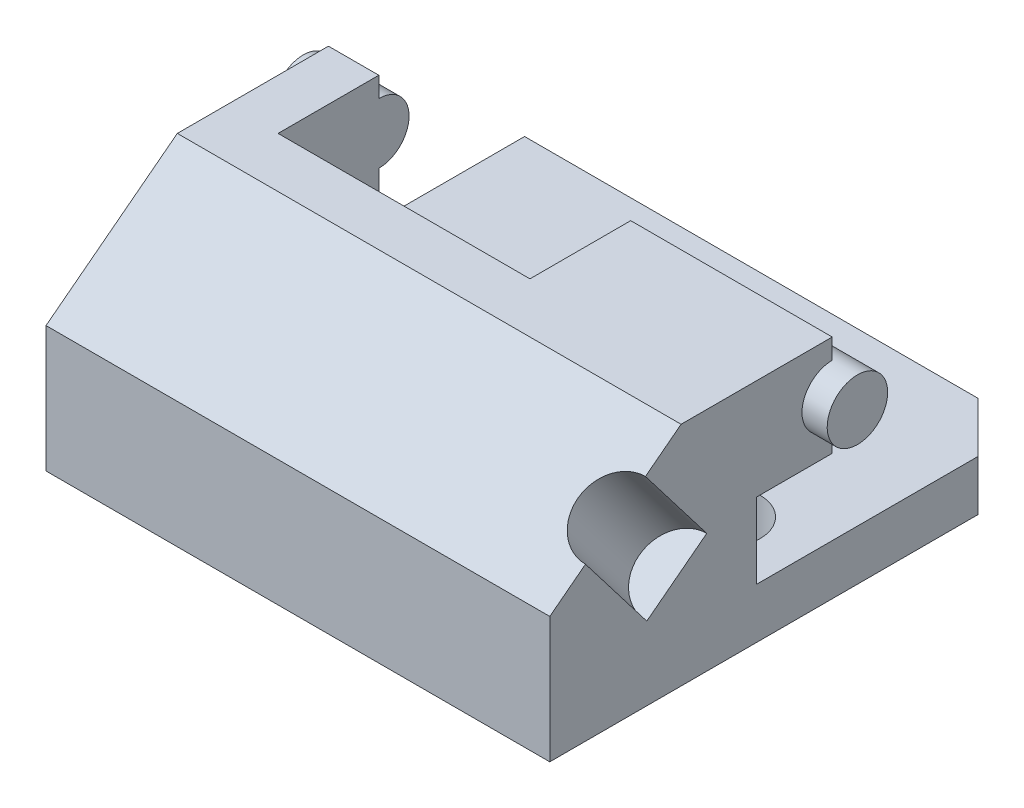
ISO-10303-21;
HEADER;
FILE_DESCRIPTION(('STEP AP214'),'2;1');
FILE_NAME('part.step','',(''),(''),'','','');
FILE_SCHEMA(('AUTOMOTIVE_DESIGN { 1 0 10303 214 1 1 1 1 }'));
ENDSEC;
DATA;
#1=APPLICATION_CONTEXT('core data for automotive mechanical design processes');
#2=APPLICATION_PROTOCOL_DEFINITION('international standard','automotive_design',2000,#1);
#3=PRODUCT_CONTEXT('',#1,'mechanical');
#4=PRODUCT('Part','Part','',(#3));
#5=PRODUCT_RELATED_PRODUCT_CATEGORY('part','',(#4));
#6=PRODUCT_DEFINITION_FORMATION('','',#4);
#7=PRODUCT_DEFINITION_CONTEXT('part definition',#1,'design');
#8=PRODUCT_DEFINITION('design','',#6,#7);
#9=PRODUCT_DEFINITION_SHAPE('','',#8);
#10=(LENGTH_UNIT() NAMED_UNIT(*) SI_UNIT(.MILLI.,.METRE.));
#11=(NAMED_UNIT(*) PLANE_ANGLE_UNIT() SI_UNIT($,.RADIAN.));
#12=(NAMED_UNIT(*) SI_UNIT($,.STERADIAN.) SOLID_ANGLE_UNIT());
#13=UNCERTAINTY_MEASURE_WITH_UNIT(LENGTH_MEASURE(1.E-05),#10,'distance_accuracy_value','');
#14=(GEOMETRIC_REPRESENTATION_CONTEXT(3) GLOBAL_UNCERTAINTY_ASSIGNED_CONTEXT((#13)) GLOBAL_UNIT_ASSIGNED_CONTEXT((#10,
#11,#12)) REPRESENTATION_CONTEXT('',''));
#15=CARTESIAN_POINT('',(0.,0.,0.));
#16=DIRECTION('',(0.,0.,1.));
#17=DIRECTION('',(1.,0.,0.));
#18=AXIS2_PLACEMENT_3D('',#15,#16,#17);
#19=CARTESIAN_POINT('',(100.,25.,-15.));
#20=DIRECTION('',(-1.,0.,0.));
#21=DIRECTION('',(0.,0.,1.));
#22=AXIS2_PLACEMENT_3D('',#19,#20,#21);
#23=CYLINDRICAL_SURFACE('',#22,6.);
#24=CARTESIAN_POINT('',(105.,25.,-15.));
#25=DIRECTION('',(1.,0.,0.));
#26=DIRECTION('',(0.,0.,-1.));
#27=AXIS2_PLACEMENT_3D('',#24,#25,#26);
#28=CIRCLE('',#27,6.00000000000001);
#29=CARTESIAN_POINT('',(105.,25.,-21.));
#30=VERTEX_POINT('',#29);
#31=EDGE_CURVE('E275',#30,#30,#28,.T.);
#32=ORIENTED_EDGE('',*,*,#31,.F.);
#33=EDGE_LOOP('',(#32));
#34=FACE_BOUND('',#33,.T.);
#35=CARTESIAN_POINT('',(60.,25.,-15.));
#36=DIRECTION('',(-1.,0.,0.));
#37=DIRECTION('',(0.,0.,1.));
#38=AXIS2_PLACEMENT_3D('',#35,#36,#37);
#39=CIRCLE('',#38,6.);
#40=CARTESIAN_POINT('',(60.,31.,-15.));
#41=VERTEX_POINT('',#40);
#42=CARTESIAN_POINT('',(60.,19.,-15.));
#43=VERTEX_POINT('',#42);
#44=EDGE_CURVE('E484',#41,#43,#39,.T.);
#45=ORIENTED_EDGE('',*,*,#44,.F.);
#46=DIRECTION('',(-1.,0.,0.));
#47=VECTOR('',#46,1.);
#48=CARTESIAN_POINT('',(100.,31.,-15.));
#49=LINE('',#48,#47);
#50=CARTESIAN_POINT('',(100.,31.,-15.));
#51=VERTEX_POINT('',#50);
#52=EDGE_CURVE('E254',#51,#41,#49,.T.);
#53=ORIENTED_EDGE('',*,*,#52,.F.);
#54=CARTESIAN_POINT('',(100.,25.,-15.));
#55=DIRECTION('',(1.,0.,0.));
#56=DIRECTION('',(0.,0.,-1.));
#57=AXIS2_PLACEMENT_3D('',#54,#55,#56);
#58=CIRCLE('',#57,6.00000000000001);
#59=CARTESIAN_POINT('',(100.,19.,-15.));
#60=VERTEX_POINT('',#59);
#61=EDGE_CURVE('E279',#51,#60,#58,.T.);
#62=ORIENTED_EDGE('',*,*,#61,.T.);
#63=DIRECTION('',(-1.,0.,0.));
#64=VECTOR('',#63,1.);
#65=CARTESIAN_POINT('',(100.,19.,-15.));
#66=LINE('',#65,#64);
#67=EDGE_CURVE('E258',#60,#43,#66,.T.);
#68=ORIENTED_EDGE('',*,*,#67,.T.);
#69=EDGE_LOOP('',(#45,#53,#62,#68));
#70=FACE_BOUND('',#69,.T.);
#71=ADVANCED_FACE('F39',(#34,#70),#23,.T.);
#72=CARTESIAN_POINT('',(-5.,25.,-15.));
#73=DIRECTION('',(-1.,0.,0.));
#74=DIRECTION('',(0.,0.,1.));
#75=AXIS2_PLACEMENT_3D('',#72,#73,#74);
#76=CIRCLE('',#75,6.00000000000001);
#77=CARTESIAN_POINT('',(-5.,25.,-8.99999999999999));
#78=VERTEX_POINT('',#77);
#79=EDGE_CURVE('E273',#78,#78,#76,.T.);
#80=ORIENTED_EDGE('',*,*,#79,.F.);
#81=EDGE_LOOP('',(#80));
#82=FACE_BOUND('',#81,.T.);
#83=CARTESIAN_POINT('',(9.99999999999999,25.,-15.));
#84=DIRECTION('',(1.,0.,0.));
#85=DIRECTION('',(0.,0.,-1.));
#86=AXIS2_PLACEMENT_3D('',#83,#84,#85);
#87=CIRCLE('',#86,6.);
#88=CARTESIAN_POINT('',(10.,19.,-15.));
#89=VERTEX_POINT('',#88);
#90=CARTESIAN_POINT('',(10.,31.,-15.));
#91=VERTEX_POINT('',#90);
#92=EDGE_CURVE('E482',#89,#91,#87,.T.);
#93=ORIENTED_EDGE('',*,*,#92,.F.);
#94=CARTESIAN_POINT('',(0.,19.,-15.));
#95=VERTEX_POINT('',#94);
#96=EDGE_CURVE('E257',#89,#95,#66,.T.);
#97=ORIENTED_EDGE('',*,*,#96,.T.);
#98=CARTESIAN_POINT('',(0.,25.,-15.));
#99=DIRECTION('',(-1.,0.,0.));
#100=DIRECTION('',(0.,0.,1.));
#101=AXIS2_PLACEMENT_3D('',#98,#99,#100);
#102=CIRCLE('',#101,6.00000000000001);
#103=CARTESIAN_POINT('',(0.,31.,-15.));
#104=VERTEX_POINT('',#103);
#105=EDGE_CURVE('E260',#95,#104,#102,.T.);
#106=ORIENTED_EDGE('',*,*,#105,.T.);
#107=EDGE_CURVE('E253',#91,#104,#49,.T.);
#108=ORIENTED_EDGE('',*,*,#107,.F.);
#109=EDGE_LOOP('',(#93,#97,#106,#108));
#110=FACE_BOUND('',#109,.T.);
#111=ADVANCED_FACE('F433',(#82,#110),#23,.T.);
#112=CARTESIAN_POINT('',(100.,0.,-15.));
#113=DIRECTION('',(0.,0.,1.));
#114=DIRECTION('',(0.,-1.,0.));
#115=AXIS2_PLACEMENT_3D('',#112,#113,#114);
#116=PLANE('',#115);
#117=ORIENTED_EDGE('',*,*,#96,.F.);
#118=DIRECTION('',(0.,1.,0.));
#119=VECTOR('',#118,1.);
#120=CARTESIAN_POINT('',(10.,-53.851648071345,-15.));
#121=LINE('',#120,#119);
#122=CARTESIAN_POINT('',(10.,15.,-15.));
#123=VERTEX_POINT('',#122);
#124=EDGE_CURVE('E354',#123,#89,#121,.T.);
#125=ORIENTED_EDGE('',*,*,#124,.F.);
#126=DIRECTION('',(-1.,0.,0.));
#127=VECTOR('',#126,1.);
#128=CARTESIAN_POINT('',(100.,15.,-15.));
#129=LINE('',#128,#127);
#130=CARTESIAN_POINT('',(0.,15.,-15.));
#131=VERTEX_POINT('',#130);
#132=EDGE_CURVE('E304',#123,#131,#129,.T.);
#133=ORIENTED_EDGE('',*,*,#132,.T.);
#134=DIRECTION('',(0.,1.,0.));
#135=VECTOR('',#134,1.);
#136=CARTESIAN_POINT('',(0.,0.,-15.));
#137=LINE('',#136,#135);
#138=EDGE_CURVE('E278',#131,#95,#137,.T.);
#139=ORIENTED_EDGE('',*,*,#138,.T.);
#140=EDGE_LOOP('',(#117,#125,#133,#139));
#141=FACE_BOUND('',#140,.T.);
#142=ADVANCED_FACE('F351',(#141),#116,.F.);
#143=CARTESIAN_POINT('',(100.,0.,-15.));
#144=DIRECTION('',(0.,0.,1.));
#145=DIRECTION('',(0.,-1.,0.));
#146=AXIS2_PLACEMENT_3D('',#143,#144,#145);
#147=PLANE('',#146);
#148=DIRECTION('',(-1.,0.,0.));
#149=VECTOR('',#148,1.);
#150=CARTESIAN_POINT('',(100.,35.,-15.));
#151=LINE('',#150,#149);
#152=CARTESIAN_POINT('',(10.,35.,-15.));
#153=VERTEX_POINT('',#152);
#154=CARTESIAN_POINT('',(0.,35.,-15.));
#155=VERTEX_POINT('',#154);
#156=EDGE_CURVE('E249',#153,#155,#151,.T.);
#157=ORIENTED_EDGE('',*,*,#156,.F.);
#158=EDGE_CURVE('E357',#91,#153,#121,.T.);
#159=ORIENTED_EDGE('',*,*,#158,.F.);
#160=ORIENTED_EDGE('',*,*,#107,.T.);
#161=DIRECTION('',(0.,1.,0.));
#162=VECTOR('',#161,1.);
#163=CARTESIAN_POINT('',(0.,0.,-15.));
#164=LINE('',#163,#162);
#165=EDGE_CURVE('E307',#104,#155,#164,.T.);
#166=ORIENTED_EDGE('',*,*,#165,.T.);
#167=EDGE_LOOP('',(#157,#159,#160,#166));
#168=FACE_BOUND('',#167,.T.);
#169=ADVANCED_FACE('F446',(#168),#147,.F.);
#170=CARTESIAN_POINT('',(100.,0.,0.));
#171=DIRECTION('',(0.,0.,1.));
#172=DIRECTION('',(1.,0.,0.));
#173=AXIS2_PLACEMENT_3D('',#170,#171,#172);
#174=PLANE('',#173);
#175=DIRECTION('',(-1.,0.,0.));
#176=VECTOR('',#175,1.);
#177=CARTESIAN_POINT('',(100.,15.,0.));
#178=LINE('',#177,#176);
#179=CARTESIAN_POINT('',(10.,15.,0.));
#180=VERTEX_POINT('',#179);
#181=CARTESIAN_POINT('',(0.,15.,0.));
#182=VERTEX_POINT('',#181);
#183=EDGE_CURVE('E331',#180,#182,#178,.T.);
#184=ORIENTED_EDGE('',*,*,#183,.F.);
#185=DIRECTION('',(0.,-1.,0.));
#186=VECTOR('',#185,1.);
#187=CARTESIAN_POINT('',(10.,0.,0.));
#188=LINE('',#187,#186);
#189=CARTESIAN_POINT('',(10.,0.,0.));
#190=VERTEX_POINT('',#189);
#191=EDGE_CURVE('E377',#180,#190,#188,.T.);
#192=ORIENTED_EDGE('',*,*,#191,.T.);
#193=DIRECTION('',(-1.,0.,0.));
#194=VECTOR('',#193,1.);
#195=CARTESIAN_POINT('',(100.,0.,0.));
#196=LINE('',#195,#194);
#197=CARTESIAN_POINT('',(0.,0.,0.));
#198=VERTEX_POINT('',#197);
#199=EDGE_CURVE('E240',#190,#198,#196,.T.);
#200=ORIENTED_EDGE('',*,*,#199,.T.);
#201=DIRECTION('',(0.,1.,0.));
#202=VECTOR('',#201,1.);
#203=CARTESIAN_POINT('',(0.,0.,0.));
#204=LINE('',#203,#202);
#205=EDGE_CURVE('E325',#198,#182,#204,.T.);
#206=ORIENTED_EDGE('',*,*,#205,.T.);
#207=EDGE_LOOP('',(#184,#192,#200,#206));
#208=FACE_BOUND('',#207,.T.);
#209=ADVANCED_FACE('F344',(#208),#174,.F.);
#210=CARTESIAN_POINT('',(100.,15.,0.));
#211=DIRECTION('',(0.,1.,0.));
#212=DIRECTION('',(0.,0.,1.));
#213=AXIS2_PLACEMENT_3D('',#210,#211,#212);
#214=PLANE('',#213);
#215=ORIENTED_EDGE('',*,*,#132,.F.);
#216=DIRECTION('',(0.,0.,1.));
#217=VECTOR('',#216,1.);
#218=CARTESIAN_POINT('',(10.,15.,0.));
#219=LINE('',#218,#217);
#220=EDGE_CURVE('E11',#123,#180,#219,.T.);
#221=ORIENTED_EDGE('',*,*,#220,.T.);
#222=ORIENTED_EDGE('',*,*,#183,.T.);
#223=DIRECTION('',(0.,0.,-1.));
#224=VECTOR('',#223,1.);
#225=CARTESIAN_POINT('',(0.,15.,0.));
#226=LINE('',#225,#224);
#227=EDGE_CURVE('E285',#182,#131,#226,.T.);
#228=ORIENTED_EDGE('',*,*,#227,.T.);
#229=EDGE_LOOP('',(#215,#221,#222,#228));
#230=FACE_BOUND('',#229,.T.);
#231=ADVANCED_FACE('F338',(#230),#214,.F.);
#232=CARTESIAN_POINT('',(100.,15.,-15.));
#233=VERTEX_POINT('',#232);
#234=CARTESIAN_POINT('',(60.,15.,-15.));
#235=VERTEX_POINT('',#234);
#236=EDGE_CURVE('E330',#233,#235,#129,.T.);
#237=ORIENTED_EDGE('',*,*,#236,.T.);
#238=DIRECTION('',(0.,1.,0.));
#239=VECTOR('',#238,1.);
#240=CARTESIAN_POINT('',(60.,-53.851648071345,-15.));
#241=LINE('',#240,#239);
#242=EDGE_CURVE('E361',#235,#43,#241,.T.);
#243=ORIENTED_EDGE('',*,*,#242,.T.);
#244=ORIENTED_EDGE('',*,*,#67,.F.);
#245=DIRECTION('',(0.,1.,0.));
#246=VECTOR('',#245,1.);
#247=CARTESIAN_POINT('',(100.,0.,-15.));
#248=LINE('',#247,#246);
#249=EDGE_CURVE('E282',#233,#60,#248,.T.);
#250=ORIENTED_EDGE('',*,*,#249,.F.);
#251=EDGE_LOOP('',(#237,#243,#244,#250));
#252=FACE_BOUND('',#251,.T.);
#253=ADVANCED_FACE('F41',(#252),#116,.F.);
#254=ORIENTED_EDGE('',*,*,#52,.T.);
#255=CARTESIAN_POINT('',(60.,35.,-15.));
#256=VERTEX_POINT('',#255);
#257=EDGE_CURVE('E364',#41,#256,#241,.T.);
#258=ORIENTED_EDGE('',*,*,#257,.T.);
#259=CARTESIAN_POINT('',(100.,35.,-15.));
#260=VERTEX_POINT('',#259);
#261=EDGE_CURVE('E250',#260,#256,#151,.T.);
#262=ORIENTED_EDGE('',*,*,#261,.F.);
#263=DIRECTION('',(0.,1.,0.));
#264=VECTOR('',#263,1.);
#265=CARTESIAN_POINT('',(100.,0.,-15.));
#266=LINE('',#265,#264);
#267=EDGE_CURVE('E284',#51,#260,#266,.T.);
#268=ORIENTED_EDGE('',*,*,#267,.F.);
#269=EDGE_LOOP('',(#254,#258,#262,#268));
#270=FACE_BOUND('',#269,.T.);
#271=ADVANCED_FACE('F442',(#270),#147,.F.);
#272=CARTESIAN_POINT('',(100.,35.,0.));
#273=DIRECTION('',(0.,1.,0.));
#274=DIRECTION('',(0.,0.,1.));
#275=AXIS2_PLACEMENT_3D('',#272,#273,#274);
#276=PLANE('',#275);
#277=DIRECTION('',(0.,0.,1.));
#278=VECTOR('',#277,1.);
#279=CARTESIAN_POINT('',(10.,35.,0.));
#280=LINE('',#279,#278);
#281=CARTESIAN_POINT('',(10.,35.,5.00000000000001));
#282=VERTEX_POINT('',#281);
#283=EDGE_CURVE('E370',#153,#282,#280,.T.);
#284=ORIENTED_EDGE('',*,*,#283,.F.);
#285=ORIENTED_EDGE('',*,*,#156,.T.);
#286=DIRECTION('',(0.,0.,-1.));
#287=VECTOR('',#286,1.);
#288=CARTESIAN_POINT('',(0.,35.,0.));
#289=LINE('',#288,#287);
#290=CARTESIAN_POINT('',(0.,35.,15.));
#291=VERTEX_POINT('',#290);
#292=EDGE_CURVE('E310',#291,#155,#289,.T.);
#293=ORIENTED_EDGE('',*,*,#292,.F.);
#294=DIRECTION('',(-1.,0.,0.));
#295=VECTOR('',#294,1.);
#296=CARTESIAN_POINT('',(100.,35.,15.));
#297=LINE('',#296,#295);
#298=CARTESIAN_POINT('',(100.,35.,15.));
#299=VERTEX_POINT('',#298);
#300=EDGE_CURVE('E247',#299,#291,#297,.T.);
#301=ORIENTED_EDGE('',*,*,#300,.F.);
#302=DIRECTION('',(0.,0.,-1.));
#303=VECTOR('',#302,1.);
#304=CARTESIAN_POINT('',(100.,35.,0.));
#305=LINE('',#304,#303);
#306=EDGE_CURVE('E287',#299,#260,#305,.T.);
#307=ORIENTED_EDGE('',*,*,#306,.T.);
#308=ORIENTED_EDGE('',*,*,#261,.T.);
#309=DIRECTION('',(0.,0.,-1.));
#310=VECTOR('',#309,1.);
#311=CARTESIAN_POINT('',(60.,35.,0.));
#312=LINE('',#311,#310);
#313=CARTESIAN_POINT('',(60.,35.,5.00000000000001));
#314=VERTEX_POINT('',#313);
#315=EDGE_CURVE('E498',#314,#256,#312,.T.);
#316=ORIENTED_EDGE('',*,*,#315,.F.);
#317=DIRECTION('',(1.,0.,0.));
#318=VECTOR('',#317,1.);
#319=CARTESIAN_POINT('',(0.,35.,5.00000000000001));
#320=LINE('',#319,#318);
#321=EDGE_CURVE('E487',#282,#314,#320,.T.);
#322=ORIENTED_EDGE('',*,*,#321,.F.);
#323=EDGE_LOOP('',(#284,#285,#293,#301,#307,#308,#316,#322));
#324=FACE_BOUND('',#323,.T.);
#325=ADVANCED_FACE('F407',(#324),#276,.T.);
#326=CARTESIAN_POINT('',(100.,29.2737769864622,22.4625591217898));
#327=DIRECTION('',(0.,0.793353340291236,0.608761429008719));
#328=DIRECTION('',(0.,-0.608761429008719,0.793353340291236));
#329=AXIS2_PLACEMENT_3D('',#326,#327,#328);
#330=PLANE('',#329);
#331=CARTESIAN_POINT('',(100.,25.,28.0322537284122));
#332=DIRECTION('',(0.,0.793353340291236,0.608761429008719));
#333=DIRECTION('',(0.,-0.608761429008719,0.793353340291236));
#334=AXIS2_PLACEMENT_3D('',#331,#332,#333);
#335=CIRCLE('',#334,7.50000000000001);
#336=CARTESIAN_POINT('',(100.,29.5657107175654,22.0821036762279));
#337=VERTEX_POINT('',#336);
#338=CARTESIAN_POINT('',(100.,20.4342892824346,33.9824037805964));
#339=VERTEX_POINT('',#338);
#340=EDGE_CURVE('E379',#337,#339,#335,.T.);
#341=ORIENTED_EDGE('',*,*,#340,.F.);
#342=DIRECTION('',(0.,0.608761429008719,-0.793353340291236));
#343=VECTOR('',#342,1.);
#344=CARTESIAN_POINT('',(100.,29.2737769864622,22.4625591217898));
#345=LINE('',#344,#343);
#346=EDGE_CURVE('E290',#337,#299,#345,.T.);
#347=ORIENTED_EDGE('',*,*,#346,.T.);
#348=ORIENTED_EDGE('',*,*,#300,.T.);
#349=DIRECTION('',(0.,0.608761429008719,-0.793353340291236));
#350=VECTOR('',#349,1.);
#351=CARTESIAN_POINT('',(0.,29.2737769864622,22.4625591217898));
#352=LINE('',#351,#350);
#353=CARTESIAN_POINT('',(0.,15.,41.0645074568242));
#354=VERTEX_POINT('',#353);
#355=EDGE_CURVE('E313',#354,#291,#352,.T.);
#356=ORIENTED_EDGE('',*,*,#355,.F.);
#357=DIRECTION('',(-1.,0.,0.));
#358=VECTOR('',#357,1.);
#359=CARTESIAN_POINT('',(100.,15.,41.0645074568242));
#360=LINE('',#359,#358);
#361=CARTESIAN_POINT('',(100.,15.,41.0645074568242));
#362=VERTEX_POINT('',#361);
#363=EDGE_CURVE('E245',#362,#354,#360,.T.);
#364=ORIENTED_EDGE('',*,*,#363,.F.);
#365=EDGE_CURVE('E291',#362,#339,#345,.T.);
#366=ORIENTED_EDGE('',*,*,#365,.T.);
#367=EDGE_LOOP('',(#341,#347,#348,#356,#364,#366));
#368=FACE_BOUND('',#367,.T.);
#369=ADVANCED_FACE('F398',(#368),#330,.T.);
#370=CARTESIAN_POINT('',(100.,0.,41.0645074568242));
#371=DIRECTION('',(0.,0.,1.));
#372=DIRECTION('',(1.,0.,0.));
#373=AXIS2_PLACEMENT_3D('',#370,#371,#372);
#374=PLANE('',#373);
#375=DIRECTION('',(0.,1.,0.));
#376=VECTOR('',#375,1.);
#377=CARTESIAN_POINT('',(0.,0.,41.0645074568242));
#378=LINE('',#377,#376);
#379=CARTESIAN_POINT('',(0.,-10.,41.0645074568242));
#380=VERTEX_POINT('',#379);
#381=EDGE_CURVE('E316',#380,#354,#378,.T.);
#382=ORIENTED_EDGE('',*,*,#381,.F.);
#383=DIRECTION('',(-1.,0.,0.));
#384=VECTOR('',#383,1.);
#385=CARTESIAN_POINT('',(100.,-10.,41.0645074568242));
#386=LINE('',#385,#384);
#387=CARTESIAN_POINT('',(100.,-10.,41.0645074568242));
#388=VERTEX_POINT('',#387);
#389=EDGE_CURVE('E237',#388,#380,#386,.T.);
#390=ORIENTED_EDGE('',*,*,#389,.F.);
#391=DIRECTION('',(0.,1.,0.));
#392=VECTOR('',#391,1.);
#393=CARTESIAN_POINT('',(100.,0.,41.0645074568242));
#394=LINE('',#393,#392);
#395=EDGE_CURVE('E294',#388,#362,#394,.T.);
#396=ORIENTED_EDGE('',*,*,#395,.T.);
#397=ORIENTED_EDGE('',*,*,#363,.T.);
#398=EDGE_LOOP('',(#382,#390,#396,#397));
#399=FACE_BOUND('',#398,.T.);
#400=ADVANCED_FACE('F415',(#399),#374,.T.);
#401=CARTESIAN_POINT('',(100.,-10.,0.));
#402=DIRECTION('',(0.,-1.,0.));
#403=DIRECTION('',(0.,0.,-1.));
#404=AXIS2_PLACEMENT_3D('',#401,#402,#403);
#405=PLANE('',#404);
#406=DIRECTION('',(-0.707106781186544,0.,-0.707106781186551));
#407=VECTOR('',#406,1.);
#408=CARTESIAN_POINT('',(100.,-10.,-43.9354925431758));
#409=LINE('',#408,#407);
#410=CARTESIAN_POINT('',(100.,-10.,-43.9354925431758));
#411=VERTEX_POINT('',#410);
#412=CARTESIAN_POINT('',(90.0000000000001,-10.,-53.9354925431758));
#413=VERTEX_POINT('',#412);
#414=EDGE_CURVE('E213',#411,#413,#409,.T.);
#415=ORIENTED_EDGE('',*,*,#414,.F.);
#416=DIRECTION('',(0.,0.,1.));
#417=VECTOR('',#416,1.);
#418=CARTESIAN_POINT('',(100.,-10.,0.));
#419=LINE('',#418,#417);
#420=EDGE_CURVE('E297',#411,#388,#419,.T.);
#421=ORIENTED_EDGE('',*,*,#420,.T.);
#422=ORIENTED_EDGE('',*,*,#389,.T.);
#423=DIRECTION('',(0.,0.,1.));
#424=VECTOR('',#423,1.);
#425=CARTESIAN_POINT('',(0.,-10.,0.));
#426=LINE('',#425,#424);
#427=CARTESIAN_POINT('',(0.,-10.,-53.9354925431758));
#428=VERTEX_POINT('',#427);
#429=EDGE_CURVE('E319',#428,#380,#426,.T.);
#430=ORIENTED_EDGE('',*,*,#429,.F.);
#431=DIRECTION('',(-1.,0.,0.));
#432=VECTOR('',#431,1.);
#433=CARTESIAN_POINT('',(100.,-10.,-53.9354925431758));
#434=LINE('',#433,#432);
#435=EDGE_CURVE('E234',#413,#428,#434,.T.);
#436=ORIENTED_EDGE('',*,*,#435,.F.);
#437=EDGE_LOOP('',(#415,#421,#422,#430,#436));
#438=FACE_BOUND('',#437,.T.);
#439=CARTESIAN_POINT('',(15.,-10.,-8.14899713183087));
#440=DIRECTION('',(0.,-1.,0.));
#441=DIRECTION('',(0.,0.,-1.));
#442=AXIS2_PLACEMENT_3D('',#439,#440,#441);
#443=CIRCLE('',#442,7.5);
#444=CARTESIAN_POINT('',(15.,-10.,-15.6489971318309));
#445=VERTEX_POINT('',#444);
#446=EDGE_CURVE('E490',#445,#445,#443,.T.);
#447=ORIENTED_EDGE('',*,*,#446,.F.);
#448=EDGE_LOOP('',(#447));
#449=FACE_BOUND('',#448,.T.);
#450=CARTESIAN_POINT('',(35.,-10.,-8.14899713183087));
#451=DIRECTION('',(0.,-1.,0.));
#452=DIRECTION('',(0.,0.,-1.));
#453=AXIS2_PLACEMENT_3D('',#450,#451,#452);
#454=CIRCLE('',#453,7.5);
#455=CARTESIAN_POINT('',(35.,-10.,-0.648997131830871));
#456=VERTEX_POINT('',#455);
#457=CARTESIAN_POINT('',(35.,-10.,-15.6489971318309));
#458=VERTEX_POINT('',#457);
#459=EDGE_CURVE('E62',#456,#458,#454,.T.);
#460=ORIENTED_EDGE('',*,*,#459,.F.);
#461=DIRECTION('',(1.,0.,0.));
#462=VECTOR('',#461,1.);
#463=CARTESIAN_POINT('',(0.,-10.,-0.648997131830871));
#464=LINE('',#463,#462);
#465=CARTESIAN_POINT('',(65.,-10.,-0.648997131830871));
#466=VERTEX_POINT('',#465);
#467=EDGE_CURVE('E522',#456,#466,#464,.T.);
#468=ORIENTED_EDGE('',*,*,#467,.T.);
#469=CARTESIAN_POINT('',(65.,-10.,-8.14899713183087));
#470=DIRECTION('',(0.,-1.,0.));
#471=DIRECTION('',(0.,0.,-1.));
#472=AXIS2_PLACEMENT_3D('',#469,#470,#471);
#473=CIRCLE('',#472,7.5);
#474=CARTESIAN_POINT('',(65.,-10.,-15.6489971318309));
#475=VERTEX_POINT('',#474);
#476=EDGE_CURVE('E536',#475,#466,#473,.T.);
#477=ORIENTED_EDGE('',*,*,#476,.F.);
#478=DIRECTION('',(1.,0.,0.));
#479=VECTOR('',#478,1.);
#480=CARTESIAN_POINT('',(0.,-10.,-15.6489971318309));
#481=LINE('',#480,#479);
#482=EDGE_CURVE('E532',#458,#475,#481,.T.);
#483=ORIENTED_EDGE('',*,*,#482,.F.);
#484=EDGE_LOOP('',(#460,#468,#477,#483));
#485=FACE_BOUND('',#484,.T.);
#486=CARTESIAN_POINT('',(85.,-10.,-8.14899713183087));
#487=DIRECTION('',(0.,-1.,0.));
#488=DIRECTION('',(0.,0.,-1.));
#489=AXIS2_PLACEMENT_3D('',#486,#487,#488);
#490=CIRCLE('',#489,7.5);
#491=CARTESIAN_POINT('',(85.,-10.,-15.6489971318309));
#492=VERTEX_POINT('',#491);
#493=EDGE_CURVE('E217',#492,#492,#490,.T.);
#494=ORIENTED_EDGE('',*,*,#493,.F.);
#495=EDGE_LOOP('',(#494));
#496=FACE_BOUND('',#495,.T.);
#497=ADVANCED_FACE('F453',(#438,#449,#485,#496),#405,.T.);
#498=CARTESIAN_POINT('',(100.,0.,-53.9354925431758));
#499=DIRECTION('',(0.,0.,-1.));
#500=DIRECTION('',(0.,1.,0.));
#501=AXIS2_PLACEMENT_3D('',#498,#499,#500);
#502=PLANE('',#501);
#503=DIRECTION('',(0.,-1.,0.));
#504=VECTOR('',#503,1.);
#505=CARTESIAN_POINT('',(90.0000000000001,0.,-53.9354925431758));
#506=LINE('',#505,#504);
#507=CARTESIAN_POINT('',(90.0000000000001,0.,-53.9354925431758));
#508=VERTEX_POINT('',#507);
#509=EDGE_CURVE('E210',#508,#413,#506,.T.);
#510=ORIENTED_EDGE('',*,*,#509,.T.);
#511=ORIENTED_EDGE('',*,*,#435,.T.);
#512=DIRECTION('',(0.,-1.,0.));
#513=VECTOR('',#512,1.);
#514=CARTESIAN_POINT('',(0.,0.,-53.9354925431758));
#515=LINE('',#514,#513);
#516=CARTESIAN_POINT('',(0.,0.,-53.9354925431758));
#517=VERTEX_POINT('',#516);
#518=EDGE_CURVE('E232',#517,#428,#515,.T.);
#519=ORIENTED_EDGE('',*,*,#518,.F.);
#520=DIRECTION('',(-1.,0.,0.));
#521=VECTOR('',#520,1.);
#522=CARTESIAN_POINT('',(100.,0.,-53.9354925431758));
#523=LINE('',#522,#521);
#524=EDGE_CURVE('E225',#508,#517,#523,.T.);
#525=ORIENTED_EDGE('',*,*,#524,.F.);
#526=EDGE_LOOP('',(#510,#511,#519,#525));
#527=FACE_BOUND('',#526,.T.);
#528=ADVANCED_FACE('F230',(#527),#502,.T.);
#529=CARTESIAN_POINT('',(100.,0.,0.));
#530=DIRECTION('',(0.,1.,0.));
#531=DIRECTION('',(0.,0.,1.));
#532=AXIS2_PLACEMENT_3D('',#529,#530,#531);
#533=PLANE('',#532);
#534=DIRECTION('',(-0.707106781186544,0.,-0.707106781186551));
#535=VECTOR('',#534,1.);
#536=CARTESIAN_POINT('',(100.,0.,-43.9354925431758));
#537=LINE('',#536,#535);
#538=CARTESIAN_POINT('',(100.,0.,-43.9354925431758));
#539=VERTEX_POINT('',#538);
#540=EDGE_CURVE('E54',#539,#508,#537,.T.);
#541=ORIENTED_EDGE('',*,*,#540,.T.);
#542=ORIENTED_EDGE('',*,*,#524,.T.);
#543=DIRECTION('',(0.,0.,-1.));
#544=VECTOR('',#543,1.);
#545=CARTESIAN_POINT('',(0.,0.,0.));
#546=LINE('',#545,#544);
#547=EDGE_CURVE('E323',#198,#517,#546,.T.);
#548=ORIENTED_EDGE('',*,*,#547,.F.);
#549=ORIENTED_EDGE('',*,*,#199,.F.);
#550=DIRECTION('',(0.,0.,-1.));
#551=VECTOR('',#550,1.);
#552=CARTESIAN_POINT('',(10.,0.,0.));
#553=LINE('',#552,#551);
#554=CARTESIAN_POINT('',(10.,0.,5.00000000000001));
#555=VERTEX_POINT('',#554);
#556=EDGE_CURVE('E359',#555,#190,#553,.T.);
#557=ORIENTED_EDGE('',*,*,#556,.F.);
#558=DIRECTION('',(-1.,0.,0.));
#559=VECTOR('',#558,1.);
#560=CARTESIAN_POINT('',(0.,0.,5.00000000000001));
#561=LINE('',#560,#559);
#562=CARTESIAN_POINT('',(60.,0.,5.00000000000001));
#563=VERTEX_POINT('',#562);
#564=EDGE_CURVE('E374',#563,#555,#561,.T.);
#565=ORIENTED_EDGE('',*,*,#564,.F.);
#566=DIRECTION('',(0.,0.,1.));
#567=VECTOR('',#566,1.);
#568=CARTESIAN_POINT('',(60.,0.,0.));
#569=LINE('',#568,#567);
#570=CARTESIAN_POINT('',(60.,0.,0.));
#571=VERTEX_POINT('',#570);
#572=EDGE_CURVE('E371',#571,#563,#569,.T.);
#573=ORIENTED_EDGE('',*,*,#572,.F.);
#574=CARTESIAN_POINT('',(100.,0.,0.));
#575=VERTEX_POINT('',#574);
#576=EDGE_CURVE('E235',#575,#571,#196,.T.);
#577=ORIENTED_EDGE('',*,*,#576,.F.);
#578=DIRECTION('',(0.,0.,-1.));
#579=VECTOR('',#578,1.);
#580=CARTESIAN_POINT('',(100.,0.,0.));
#581=LINE('',#580,#579);
#582=EDGE_CURVE('E228',#575,#539,#581,.T.);
#583=ORIENTED_EDGE('',*,*,#582,.T.);
#584=EDGE_LOOP('',(#541,#542,#548,#549,#557,#565,#573,#577,#583));
#585=FACE_BOUND('',#584,.T.);
#586=CARTESIAN_POINT('',(15.,0.,-8.14899713183087));
#587=DIRECTION('',(0.,-1.,0.));
#588=DIRECTION('',(0.,0.,-1.));
#589=AXIS2_PLACEMENT_3D('',#586,#587,#588);
#590=CIRCLE('',#589,7.5);
#591=CARTESIAN_POINT('',(15.,0.,-15.6489971318309));
#592=VERTEX_POINT('',#591);
#593=EDGE_CURVE('E485',#592,#592,#590,.T.);
#594=ORIENTED_EDGE('',*,*,#593,.T.);
#595=EDGE_LOOP('',(#594));
#596=FACE_BOUND('',#595,.T.);
#597=CARTESIAN_POINT('',(35.,0.,-8.14899713183087));
#598=DIRECTION('',(0.,-1.,0.));
#599=DIRECTION('',(0.,0.,-1.));
#600=AXIS2_PLACEMENT_3D('',#597,#598,#599);
#601=CIRCLE('',#600,7.5);
#602=CARTESIAN_POINT('',(35.,0.,-0.648997131830867));
#603=VERTEX_POINT('',#602);
#604=CARTESIAN_POINT('',(35.,0.,-15.6489971318309));
#605=VERTEX_POINT('',#604);
#606=EDGE_CURVE('E518',#603,#605,#601,.T.);
#607=ORIENTED_EDGE('',*,*,#606,.T.);
#608=DIRECTION('',(1.,0.,0.));
#609=VECTOR('',#608,1.);
#610=CARTESIAN_POINT('',(0.,0.,-15.6489971318309));
#611=LINE('',#610,#609);
#612=CARTESIAN_POINT('',(65.,0.,-15.6489971318309));
#613=VERTEX_POINT('',#612);
#614=EDGE_CURVE('E521',#605,#613,#611,.T.);
#615=ORIENTED_EDGE('',*,*,#614,.T.);
#616=CARTESIAN_POINT('',(65.,0.,-8.14899713183087));
#617=DIRECTION('',(0.,-1.,0.));
#618=DIRECTION('',(0.,0.,-1.));
#619=AXIS2_PLACEMENT_3D('',#616,#617,#618);
#620=CIRCLE('',#619,7.5);
#621=CARTESIAN_POINT('',(65.,0.,-0.648997131830867));
#622=VERTEX_POINT('',#621);
#623=EDGE_CURVE('E525',#613,#622,#620,.T.);
#624=ORIENTED_EDGE('',*,*,#623,.T.);
#625=DIRECTION('',(1.,0.,0.));
#626=VECTOR('',#625,1.);
#627=CARTESIAN_POINT('',(0.,0.,-0.648997131830867));
#628=LINE('',#627,#626);
#629=EDGE_CURVE('E528',#603,#622,#628,.T.);
#630=ORIENTED_EDGE('',*,*,#629,.F.);
#631=EDGE_LOOP('',(#607,#615,#624,#630));
#632=FACE_BOUND('',#631,.T.);
#633=CARTESIAN_POINT('',(85.,0.,-8.14899713183087));
#634=DIRECTION('',(0.,-1.,0.));
#635=DIRECTION('',(0.,0.,-1.));
#636=AXIS2_PLACEMENT_3D('',#633,#634,#635);
#637=CIRCLE('',#636,7.5);
#638=CARTESIAN_POINT('',(85.,0.,-15.6489971318309));
#639=VERTEX_POINT('',#638);
#640=EDGE_CURVE('E533',#639,#639,#637,.T.);
#641=ORIENTED_EDGE('',*,*,#640,.T.);
#642=EDGE_LOOP('',(#641));
#643=FACE_BOUND('',#642,.T.);
#644=ADVANCED_FACE('F222',(#585,#596,#632,#643),#533,.T.);
#645=ORIENTED_EDGE('',*,*,#576,.T.);
#646=DIRECTION('',(0.,1.,0.));
#647=VECTOR('',#646,1.);
#648=CARTESIAN_POINT('',(60.,0.,0.));
#649=LINE('',#648,#647);
#650=CARTESIAN_POINT('',(60.,15.,0.));
#651=VERTEX_POINT('',#650);
#652=EDGE_CURVE('E373',#571,#651,#649,.T.);
#653=ORIENTED_EDGE('',*,*,#652,.T.);
#654=CARTESIAN_POINT('',(100.,15.,0.));
#655=VERTEX_POINT('',#654);
#656=EDGE_CURVE('E332',#655,#651,#178,.T.);
#657=ORIENTED_EDGE('',*,*,#656,.F.);
#658=DIRECTION('',(0.,1.,0.));
#659=VECTOR('',#658,1.);
#660=CARTESIAN_POINT('',(100.,0.,0.));
#661=LINE('',#660,#659);
#662=EDGE_CURVE('E300',#575,#655,#661,.T.);
#663=ORIENTED_EDGE('',*,*,#662,.F.);
#664=EDGE_LOOP('',(#645,#653,#657,#663));
#665=FACE_BOUND('',#664,.T.);
#666=ADVANCED_FACE('F461',(#665),#174,.F.);
#667=ORIENTED_EDGE('',*,*,#656,.T.);
#668=DIRECTION('',(0.,0.,-1.));
#669=VECTOR('',#668,1.);
#670=CARTESIAN_POINT('',(60.,15.,0.));
#671=LINE('',#670,#669);
#672=EDGE_CURVE('E47',#651,#235,#671,.T.);
#673=ORIENTED_EDGE('',*,*,#672,.T.);
#674=ORIENTED_EDGE('',*,*,#236,.F.);
#675=DIRECTION('',(0.,0.,-1.));
#676=VECTOR('',#675,1.);
#677=CARTESIAN_POINT('',(100.,15.,0.));
#678=LINE('',#677,#676);
#679=EDGE_CURVE('E302',#655,#233,#678,.T.);
#680=ORIENTED_EDGE('',*,*,#679,.F.);
#681=EDGE_LOOP('',(#667,#673,#674,#680));
#682=FACE_BOUND('',#681,.T.);
#683=ADVANCED_FACE('F464',(#682),#214,.F.);
#684=CARTESIAN_POINT('',(100.,0.,0.));
#685=DIRECTION('',(1.,0.,0.));
#686=DIRECTION('',(0.,0.,-1.));
#687=AXIS2_PLACEMENT_3D('',#684,#685,#686);
#688=PLANE('',#687);
#689=DIRECTION('',(0.,-1.,0.));
#690=VECTOR('',#689,1.);
#691=CARTESIAN_POINT('',(100.,0.,-43.9354925431758));
#692=LINE('',#691,#690);
#693=EDGE_CURVE('E218',#539,#411,#692,.T.);
#694=ORIENTED_EDGE('',*,*,#693,.F.);
#695=ORIENTED_EDGE('',*,*,#582,.F.);
#696=ORIENTED_EDGE('',*,*,#662,.T.);
#697=ORIENTED_EDGE('',*,*,#679,.T.);
#698=ORIENTED_EDGE('',*,*,#249,.T.);
#699=ORIENTED_EDGE('',*,*,#61,.F.);
#700=ORIENTED_EDGE('',*,*,#267,.T.);
#701=ORIENTED_EDGE('',*,*,#306,.F.);
#702=ORIENTED_EDGE('',*,*,#346,.F.);
#703=DIRECTION('',(0.,0.793353340291236,0.608761429008719));
#704=VECTOR('',#703,1.);
#705=CARTESIAN_POINT('',(100.,13.6986439117407,9.90687509605348));
#706=LINE('',#705,#704);
#707=CARTESIAN_POINT('',(100.,13.6986439117407,9.90687509605348));
#708=VERTEX_POINT('',#707);
#709=EDGE_CURVE('E384',#708,#337,#706,.T.);
#710=ORIENTED_EDGE('',*,*,#709,.F.);
#711=DIRECTION('',(0.,0.608761429008719,-0.793353340291236));
#712=VECTOR('',#711,1.);
#713=CARTESIAN_POINT('',(100.,13.4067101806375,10.2873305416154));
#714=LINE('',#713,#712);
#715=CARTESIAN_POINT('',(100.,4.56722247660989,21.807175200422));
#716=VERTEX_POINT('',#715);
#717=EDGE_CURVE('E380',#716,#708,#714,.T.);
#718=ORIENTED_EDGE('',*,*,#717,.F.);
#719=DIRECTION('',(0.,0.793353340291236,0.608761429008719));
#720=VECTOR('',#719,1.);
#721=CARTESIAN_POINT('',(100.,4.56722247660989,21.807175200422));
#722=LINE('',#721,#720);
#723=EDGE_CURVE('E386',#716,#339,#722,.T.);
#724=ORIENTED_EDGE('',*,*,#723,.T.);
#725=ORIENTED_EDGE('',*,*,#365,.F.);
#726=ORIENTED_EDGE('',*,*,#395,.F.);
#727=ORIENTED_EDGE('',*,*,#420,.F.);
#728=EDGE_LOOP('',(#694,#695,#696,#697,#698,#699,#700,#701,#702,#710,#718,#724,#725,#726,#727));
#729=FACE_BOUND('',#728,.T.);
#730=ADVANCED_FACE('F402',(#729),#688,.T.);
#731=CARTESIAN_POINT('',(0.,0.,0.));
#732=DIRECTION('',(1.,0.,0.));
#733=DIRECTION('',(0.,0.,-1.));
#734=AXIS2_PLACEMENT_3D('',#731,#732,#733);
#735=PLANE('',#734);
#736=ORIENTED_EDGE('',*,*,#105,.F.);
#737=ORIENTED_EDGE('',*,*,#138,.F.);
#738=ORIENTED_EDGE('',*,*,#227,.F.);
#739=ORIENTED_EDGE('',*,*,#205,.F.);
#740=ORIENTED_EDGE('',*,*,#547,.T.);
#741=ORIENTED_EDGE('',*,*,#518,.T.);
#742=ORIENTED_EDGE('',*,*,#429,.T.);
#743=ORIENTED_EDGE('',*,*,#381,.T.);
#744=ORIENTED_EDGE('',*,*,#355,.T.);
#745=ORIENTED_EDGE('',*,*,#292,.T.);
#746=ORIENTED_EDGE('',*,*,#165,.F.);
#747=EDGE_LOOP('',(#736,#737,#738,#739,#740,#741,#742,#743,#744,#745,#746));
#748=FACE_BOUND('',#747,.T.);
#749=ADVANCED_FACE('F347',(#748),#735,.F.);
#750=CARTESIAN_POINT('',(105.,25.,-15.));
#751=DIRECTION('',(1.,0.,0.));
#752=DIRECTION('',(0.,0.,-1.));
#753=AXIS2_PLACEMENT_3D('',#750,#751,#752);
#754=PLANE('',#753);
#755=ORIENTED_EDGE('',*,*,#31,.T.);
#756=EDGE_LOOP('',(#755));
#757=FACE_BOUND('',#756,.T.);
#758=ADVANCED_FACE('F470',(#757),#754,.T.);
#759=CARTESIAN_POINT('',(-5.,25.,-15.));
#760=DIRECTION('',(-1.,0.,0.));
#761=DIRECTION('',(0.,0.,1.));
#762=AXIS2_PLACEMENT_3D('',#759,#760,#761);
#763=PLANE('',#762);
#764=ORIENTED_EDGE('',*,*,#79,.T.);
#765=EDGE_LOOP('',(#764));
#766=FACE_BOUND('',#765,.T.);
#767=ADVANCED_FACE('F429',(#766),#763,.T.);
#768=CARTESIAN_POINT('',(100.,9.1329331941753,15.8570251482378));
#769=DIRECTION('',(0.,0.793353340291236,0.608761429008719));
#770=DIRECTION('',(0.,-0.608761429008719,0.793353340291236));
#771=AXIS2_PLACEMENT_3D('',#768,#769,#770);
#772=CYLINDRICAL_SURFACE('',#771,7.50000000000001);
#773=ORIENTED_EDGE('',*,*,#340,.T.);
#774=ORIENTED_EDGE('',*,*,#723,.F.);
#775=CARTESIAN_POINT('',(100.,9.1329331941753,15.8570251482378));
#776=DIRECTION('',(0.,0.793353340291236,0.608761429008719));
#777=DIRECTION('',(0.,-0.608761429008719,0.793353340291236));
#778=AXIS2_PLACEMENT_3D('',#775,#776,#777);
#779=CIRCLE('',#778,7.50000000000001);
#780=EDGE_CURVE('E382',#708,#716,#779,.T.);
#781=ORIENTED_EDGE('',*,*,#780,.F.);
#782=ORIENTED_EDGE('',*,*,#709,.T.);
#783=EDGE_LOOP('',(#773,#774,#781,#782));
#784=FACE_BOUND('',#783,.T.);
#785=ADVANCED_FACE('F392',(#784),#772,.F.);
#786=CARTESIAN_POINT('',(0.,13.4067101806375,10.2873305416154));
#787=DIRECTION('',(0.,0.793353340291236,0.608761429008719));
#788=DIRECTION('',(0.,-0.608761429008719,0.793353340291236));
#789=AXIS2_PLACEMENT_3D('',#786,#787,#788);
#790=PLANE('',#789);
#791=ORIENTED_EDGE('',*,*,#717,.T.);
#792=ORIENTED_EDGE('',*,*,#780,.T.);
#793=EDGE_LOOP('',(#791,#792));
#794=FACE_BOUND('',#793,.T.);
#795=ADVANCED_FACE('F419',(#794),#790,.T.);
#796=CARTESIAN_POINT('',(10.,-53.851648071345,0.));
#797=DIRECTION('',(-1.,0.,0.));
#798=DIRECTION('',(0.,0.,1.));
#799=AXIS2_PLACEMENT_3D('',#796,#797,#798);
#800=PLANE('',#799);
#801=ORIENTED_EDGE('',*,*,#220,.F.);
#802=ORIENTED_EDGE('',*,*,#124,.T.);
#803=ORIENTED_EDGE('',*,*,#92,.T.);
#804=ORIENTED_EDGE('',*,*,#158,.T.);
#805=ORIENTED_EDGE('',*,*,#283,.T.);
#806=DIRECTION('',(0.,1.,0.));
#807=VECTOR('',#806,1.);
#808=CARTESIAN_POINT('',(10.,-53.851648071345,5.00000000000001));
#809=LINE('',#808,#807);
#810=EDGE_CURVE('E356',#555,#282,#809,.T.);
#811=ORIENTED_EDGE('',*,*,#810,.F.);
#812=ORIENTED_EDGE('',*,*,#556,.T.);
#813=ORIENTED_EDGE('',*,*,#191,.F.);
#814=EDGE_LOOP('',(#801,#802,#803,#804,#805,#811,#812,#813));
#815=FACE_BOUND('',#814,.T.);
#816=ADVANCED_FACE('F421',(#815),#800,.F.);
#817=CARTESIAN_POINT('',(60.,-53.851648071345,0.));
#818=DIRECTION('',(1.,0.,0.));
#819=DIRECTION('',(0.,0.,-1.));
#820=AXIS2_PLACEMENT_3D('',#817,#818,#819);
#821=PLANE('',#820);
#822=ORIENTED_EDGE('',*,*,#572,.T.);
#823=DIRECTION('',(0.,1.,0.));
#824=VECTOR('',#823,1.);
#825=CARTESIAN_POINT('',(60.,-53.851648071345,5.00000000000001));
#826=LINE('',#825,#824);
#827=EDGE_CURVE('E367',#563,#314,#826,.T.);
#828=ORIENTED_EDGE('',*,*,#827,.T.);
#829=ORIENTED_EDGE('',*,*,#315,.T.);
#830=ORIENTED_EDGE('',*,*,#257,.F.);
#831=ORIENTED_EDGE('',*,*,#44,.T.);
#832=ORIENTED_EDGE('',*,*,#242,.F.);
#833=ORIENTED_EDGE('',*,*,#672,.F.);
#834=ORIENTED_EDGE('',*,*,#652,.F.);
#835=EDGE_LOOP('',(#822,#828,#829,#830,#831,#832,#833,#834));
#836=FACE_BOUND('',#835,.T.);
#837=ADVANCED_FACE('F427',(#836),#821,.F.);
#838=CARTESIAN_POINT('',(0.,-53.851648071345,5.00000000000001));
#839=DIRECTION('',(0.,0.,1.));
#840=DIRECTION('',(1.,0.,0.));
#841=AXIS2_PLACEMENT_3D('',#838,#839,#840);
#842=PLANE('',#841);
#843=ORIENTED_EDGE('',*,*,#564,.T.);
#844=ORIENTED_EDGE('',*,*,#810,.T.);
#845=ORIENTED_EDGE('',*,*,#321,.T.);
#846=ORIENTED_EDGE('',*,*,#827,.F.);
#847=EDGE_LOOP('',(#843,#844,#845,#846));
#848=FACE_BOUND('',#847,.T.);
#849=ADVANCED_FACE('F505',(#848),#842,.F.);
#850=CARTESIAN_POINT('',(85.,0.,-8.14899713183087));
#851=DIRECTION('',(0.,-1.,0.));
#852=DIRECTION('',(0.,0.,-1.));
#853=AXIS2_PLACEMENT_3D('',#850,#851,#852);
#854=CYLINDRICAL_SURFACE('',#853,7.5);
#855=ORIENTED_EDGE('',*,*,#640,.F.);
#856=EDGE_LOOP('',(#855));
#857=FACE_BOUND('',#856,.T.);
#858=ORIENTED_EDGE('',*,*,#493,.T.);
#859=EDGE_LOOP('',(#858));
#860=FACE_BOUND('',#859,.T.);
#861=ADVANCED_FACE('F552',(#857,#860),#854,.F.);
#862=CARTESIAN_POINT('',(35.,0.,-8.14899713183087));
#863=DIRECTION('',(0.,-1.,0.));
#864=DIRECTION('',(0.,0.,-1.));
#865=AXIS2_PLACEMENT_3D('',#862,#863,#864);
#866=CYLINDRICAL_SURFACE('',#865,7.5);
#867=ORIENTED_EDGE('',*,*,#459,.T.);
#868=DIRECTION('',(0.,-1.,0.));
#869=VECTOR('',#868,1.);
#870=CARTESIAN_POINT('',(35.,0.,-15.6489971318309));
#871=LINE('',#870,#869);
#872=EDGE_CURVE('E530',#605,#458,#871,.T.);
#873=ORIENTED_EDGE('',*,*,#872,.F.);
#874=ORIENTED_EDGE('',*,*,#606,.F.);
#875=DIRECTION('',(0.,-1.,0.));
#876=VECTOR('',#875,1.);
#877=CARTESIAN_POINT('',(35.,0.,-0.648997131830867));
#878=LINE('',#877,#876);
#879=EDGE_CURVE('E517',#603,#456,#878,.T.);
#880=ORIENTED_EDGE('',*,*,#879,.T.);
#881=EDGE_LOOP('',(#867,#873,#874,#880));
#882=FACE_BOUND('',#881,.T.);
#883=ADVANCED_FACE('F555',(#882),#866,.F.);
#884=CARTESIAN_POINT('',(0.,0.,-0.648997131830867));
#885=DIRECTION('',(0.,0.,-1.));
#886=DIRECTION('',(0.,1.,0.));
#887=AXIS2_PLACEMENT_3D('',#884,#885,#886);
#888=PLANE('',#887);
#889=ORIENTED_EDGE('',*,*,#467,.F.);
#890=ORIENTED_EDGE('',*,*,#879,.F.);
#891=ORIENTED_EDGE('',*,*,#629,.T.);
#892=DIRECTION('',(0.,-1.,0.));
#893=VECTOR('',#892,1.);
#894=CARTESIAN_POINT('',(65.,0.,-0.648997131830867));
#895=LINE('',#894,#893);
#896=EDGE_CURVE('E542',#622,#466,#895,.T.);
#897=ORIENTED_EDGE('',*,*,#896,.T.);
#898=EDGE_LOOP('',(#889,#890,#891,#897));
#899=FACE_BOUND('',#898,.T.);
#900=ADVANCED_FACE('F562',(#899),#888,.T.);
#901=CARTESIAN_POINT('',(65.,0.,-8.14899713183087));
#902=DIRECTION('',(0.,-1.,0.));
#903=DIRECTION('',(0.,0.,-1.));
#904=AXIS2_PLACEMENT_3D('',#901,#902,#903);
#905=CYLINDRICAL_SURFACE('',#904,7.5);
#906=ORIENTED_EDGE('',*,*,#476,.T.);
#907=ORIENTED_EDGE('',*,*,#896,.F.);
#908=ORIENTED_EDGE('',*,*,#623,.F.);
#909=DIRECTION('',(0.,-1.,0.));
#910=VECTOR('',#909,1.);
#911=CARTESIAN_POINT('',(65.,0.,-15.6489971318309));
#912=LINE('',#911,#910);
#913=EDGE_CURVE('E544',#613,#475,#912,.T.);
#914=ORIENTED_EDGE('',*,*,#913,.T.);
#915=EDGE_LOOP('',(#906,#907,#908,#914));
#916=FACE_BOUND('',#915,.T.);
#917=ADVANCED_FACE('F658',(#916),#905,.F.);
#918=CARTESIAN_POINT('',(0.,0.,-15.6489971318309));
#919=DIRECTION('',(0.,0.,-1.));
#920=DIRECTION('',(0.,1.,0.));
#921=AXIS2_PLACEMENT_3D('',#918,#919,#920);
#922=PLANE('',#921);
#923=ORIENTED_EDGE('',*,*,#482,.T.);
#924=ORIENTED_EDGE('',*,*,#913,.F.);
#925=ORIENTED_EDGE('',*,*,#614,.F.);
#926=ORIENTED_EDGE('',*,*,#872,.T.);
#927=EDGE_LOOP('',(#923,#924,#925,#926));
#928=FACE_BOUND('',#927,.T.);
#929=ADVANCED_FACE('F667',(#928),#922,.F.);
#930=CARTESIAN_POINT('',(15.,0.,-8.14899713183087));
#931=DIRECTION('',(0.,-1.,0.));
#932=DIRECTION('',(0.,0.,-1.));
#933=AXIS2_PLACEMENT_3D('',#930,#931,#932);
#934=CYLINDRICAL_SURFACE('',#933,7.5);
#935=ORIENTED_EDGE('',*,*,#593,.F.);
#936=EDGE_LOOP('',(#935));
#937=FACE_BOUND('',#936,.T.);
#938=ORIENTED_EDGE('',*,*,#446,.T.);
#939=EDGE_LOOP('',(#938));
#940=FACE_BOUND('',#939,.T.);
#941=ADVANCED_FACE('F676',(#937,#940),#934,.F.);
#942=CARTESIAN_POINT('',(100.,0.,-43.9354925431758));
#943=DIRECTION('',(-0.707106781186551,0.,0.707106781186544));
#944=DIRECTION('',(0.707106781186544,0.,0.707106781186551));
#945=AXIS2_PLACEMENT_3D('',#942,#943,#944);
#946=PLANE('',#945);
#947=ORIENTED_EDGE('',*,*,#414,.T.);
#948=ORIENTED_EDGE('',*,*,#509,.F.);
#949=ORIENTED_EDGE('',*,*,#540,.F.);
#950=ORIENTED_EDGE('',*,*,#693,.T.);
#951=EDGE_LOOP('',(#947,#948,#949,#950));
#952=FACE_BOUND('',#951,.T.);
#953=ADVANCED_FACE('F211',(#952),#946,.F.);
#954=CLOSED_SHELL('',(#71,#111,#142,#169,#209,#231,#253,#271,#325,#369,#400,#497,#528,#644,#666,
#683,#730,#749,#758,#767,#785,#795,#816,#837,#849,#861,#883,#900,#917,#929,#941,#953));
#955=MANIFOLD_SOLID_BREP('B2',#954);
#956=ADVANCED_BREP_SHAPE_REPRESENTATION('',(#18,#955),#14);
#957=SHAPE_DEFINITION_REPRESENTATION(#9,#956);
ENDSEC;
END-ISO-10303-21;
